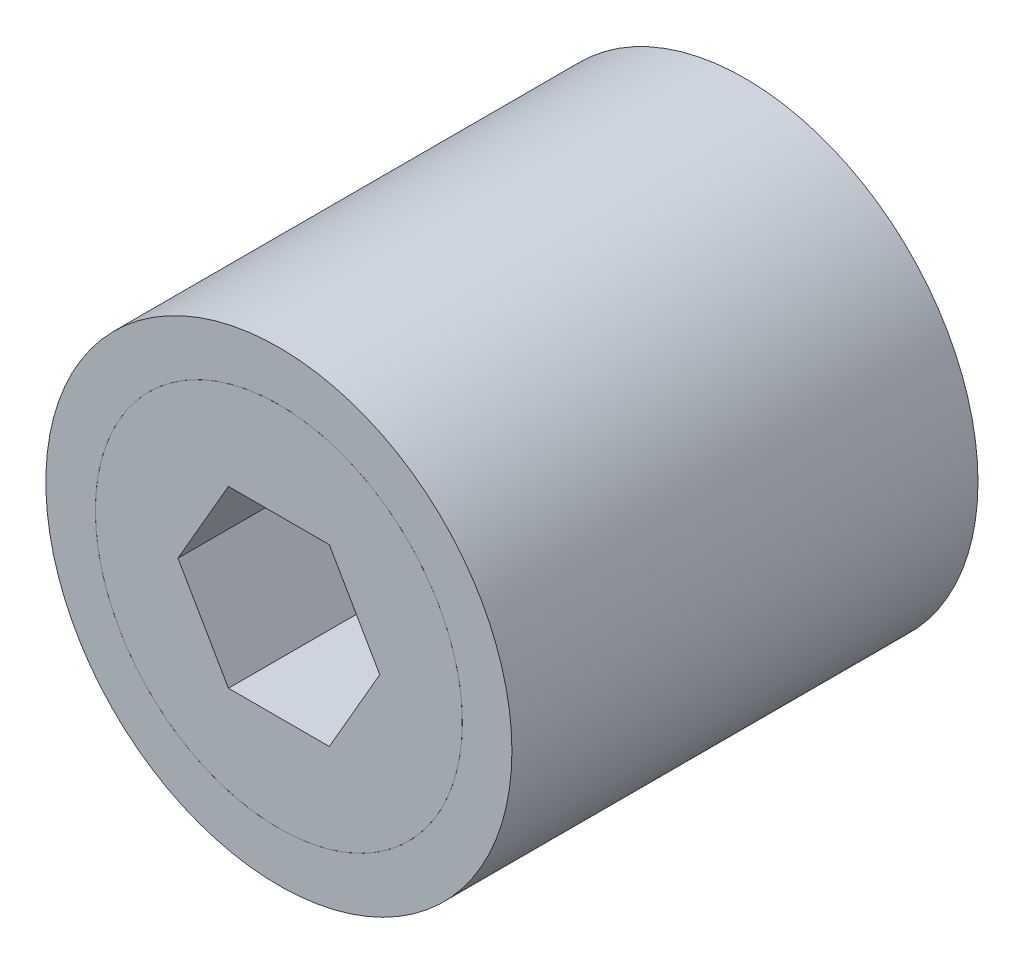
ISO-10303-21;
HEADER;
FILE_DESCRIPTION(('STEP AP214'),'2;1');
FILE_NAME('part.step','',(''),(''),'','','');
FILE_SCHEMA(('AUTOMOTIVE_DESIGN { 1 0 10303 214 1 1 1 1 }'));
ENDSEC;
DATA;
#1=APPLICATION_CONTEXT('core data for automotive mechanical design processes');
#2=APPLICATION_PROTOCOL_DEFINITION('international standard','automotive_design',2000,#1);
#3=PRODUCT_CONTEXT('',#1,'mechanical');
#4=PRODUCT('Part','Part','',(#3));
#5=PRODUCT_RELATED_PRODUCT_CATEGORY('part','',(#4));
#6=PRODUCT_DEFINITION_FORMATION('','',#4);
#7=PRODUCT_DEFINITION_CONTEXT('part definition',#1,'design');
#8=PRODUCT_DEFINITION('design','',#6,#7);
#9=PRODUCT_DEFINITION_SHAPE('','',#8);
#10=(LENGTH_UNIT() NAMED_UNIT(*) SI_UNIT(.MILLI.,.METRE.));
#11=(NAMED_UNIT(*) PLANE_ANGLE_UNIT() SI_UNIT($,.RADIAN.));
#12=(NAMED_UNIT(*) SI_UNIT($,.STERADIAN.) SOLID_ANGLE_UNIT());
#13=UNCERTAINTY_MEASURE_WITH_UNIT(LENGTH_MEASURE(1.E-05),#10,'distance_accuracy_value','');
#14=(GEOMETRIC_REPRESENTATION_CONTEXT(3) GLOBAL_UNCERTAINTY_ASSIGNED_CONTEXT((#13)) GLOBAL_UNIT_ASSIGNED_CONTEXT((#10,
#11,#12)) REPRESENTATION_CONTEXT('',''));
#15=CARTESIAN_POINT('',(0.,0.,0.));
#16=DIRECTION('',(0.,0.,1.));
#17=DIRECTION('',(1.,0.,0.));
#18=AXIS2_PLACEMENT_3D('',#15,#16,#17);
#19=CARTESIAN_POINT('',(-23.3252483873999,13.6361395501214,57.26277572465));
#20=DIRECTION('',(0.,1.,0.));
#21=DIRECTION('',(-1.,0.,0.));
#22=AXIS2_PLACEMENT_3D('',#19,#20,#21);
#23=PLANE('',#22);
#24=DIRECTION('',(1.,0.,0.));
#25=VECTOR('',#24,1.);
#26=CARTESIAN_POINT('',(-20.5756177303843,13.6361395501214,57.26277572465));
#27=LINE('',#26,#25);
#28=CARTESIAN_POINT('',(-17.8259870733687,13.6361395501214,57.26277572465));
#29=VERTEX_POINT('',#28);
#30=CARTESIAN_POINT('',(-23.3252483873999,13.6361395501214,57.26277572465));
#31=VERTEX_POINT('',#30);
#32=EDGE_CURVE('P0_E91',#29,#31,#27,.F.);
#33=ORIENTED_EDGE('',*,*,#32,.F.);
#34=DIRECTION('',(0.,0.,1.));
#35=VECTOR('',#34,1.);
#36=CARTESIAN_POINT('',(-17.8259870733687,13.6361395501214,57.26277572465));
#37=LINE('',#36,#35);
#38=CARTESIAN_POINT('',(-17.8259870733687,13.6361395501214,31.86277572465));
#39=VERTEX_POINT('',#38);
#40=EDGE_CURVE('P0_E83',#39,#29,#37,.T.);
#41=ORIENTED_EDGE('',*,*,#40,.F.);
#42=DIRECTION('',(1.,0.,0.));
#43=VECTOR('',#42,1.);
#44=CARTESIAN_POINT('',(-20.5756177303843,13.6361395501214,31.86277572465));
#45=LINE('',#44,#43);
#46=CARTESIAN_POINT('',(-23.3252483873999,13.6361395501214,31.86277572465));
#47=VERTEX_POINT('',#46);
#48=EDGE_CURVE('P0_E123',#39,#47,#45,.F.);
#49=ORIENTED_EDGE('',*,*,#48,.T.);
#50=DIRECTION('',(0.,0.,1.));
#51=VECTOR('',#50,1.);
#52=CARTESIAN_POINT('',(-23.3252483873999,13.6361395501214,57.26277572465));
#53=LINE('',#52,#51);
#54=EDGE_CURVE('P0_E108',#31,#47,#53,.F.);
#55=ORIENTED_EDGE('',*,*,#54,.F.);
#56=EDGE_LOOP('',(#33,#41,#49,#55));
#57=FACE_BOUND('',#56,.T.);
#58=ADVANCED_FACE('P0_F24',(#57),#23,.T.);
#59=CARTESIAN_POINT('',(-26.0748790444155,18.3986395501214,57.26277572465));
#60=DIRECTION('',(0.866025403784438,0.5,0.));
#61=DIRECTION('',(-0.5,0.866025403784438,0.));
#62=AXIS2_PLACEMENT_3D('',#59,#60,#61);
#63=PLANE('',#62);
#64=DIRECTION('',(-0.500000000000001,0.866025403784438,0.));
#65=VECTOR('',#64,1.);
#66=CARTESIAN_POINT('',(-23.3252483873999,13.6361395501214,57.26277572465));
#67=LINE('',#66,#65);
#68=CARTESIAN_POINT('',(-26.0748790444155,18.3986395501214,57.26277572465));
#69=VERTEX_POINT('',#68);
#70=EDGE_CURVE('P0_E116',#31,#69,#67,.T.);
#71=ORIENTED_EDGE('',*,*,#70,.F.);
#72=ORIENTED_EDGE('',*,*,#54,.T.);
#73=DIRECTION('',(-0.500000000000001,0.866025403784438,0.));
#74=VECTOR('',#73,1.);
#75=CARTESIAN_POINT('',(-23.3252483873999,13.6361395501214,31.86277572465));
#76=LINE('',#75,#74);
#77=CARTESIAN_POINT('',(-26.0748790444155,18.3986395501214,31.86277572465));
#78=VERTEX_POINT('',#77);
#79=EDGE_CURVE('P0_E114',#47,#78,#76,.T.);
#80=ORIENTED_EDGE('',*,*,#79,.T.);
#81=DIRECTION('',(0.,0.,1.));
#82=VECTOR('',#81,1.);
#83=CARTESIAN_POINT('',(-26.0748790444155,18.3986395501214,57.26277572465));
#84=LINE('',#83,#82);
#85=EDGE_CURVE('P0_E105',#69,#78,#84,.F.);
#86=ORIENTED_EDGE('',*,*,#85,.F.);
#87=EDGE_LOOP('',(#71,#72,#80,#86));
#88=FACE_BOUND('',#87,.T.);
#89=ADVANCED_FACE('P0_F113',(#88),#63,.T.);
#90=CARTESIAN_POINT('',(-23.3252483873999,23.1611395501214,57.26277572465));
#91=DIRECTION('',(0.866025403784439,-0.5,0.));
#92=DIRECTION('',(0.5,0.866025403784439,0.));
#93=AXIS2_PLACEMENT_3D('',#90,#91,#92);
#94=PLANE('',#93);
#95=DIRECTION('',(0.5,0.866025403784438,0.));
#96=VECTOR('',#95,1.);
#97=CARTESIAN_POINT('',(-26.0748790444155,18.3986395501214,57.26277572465));
#98=LINE('',#97,#96);
#99=CARTESIAN_POINT('',(-23.3252483873999,23.1611395501214,57.26277572465));
#100=VERTEX_POINT('',#99);
#101=EDGE_CURVE('P0_E133',#69,#100,#98,.T.);
#102=ORIENTED_EDGE('',*,*,#101,.F.);
#103=ORIENTED_EDGE('',*,*,#85,.T.);
#104=DIRECTION('',(0.5,0.866025403784438,0.));
#105=VECTOR('',#104,1.);
#106=CARTESIAN_POINT('',(-26.0748790444155,18.3986395501214,31.86277572465));
#107=LINE('',#106,#105);
#108=CARTESIAN_POINT('',(-23.3252483873999,23.1611395501214,31.8627757246499));
#109=VERTEX_POINT('',#108);
#110=EDGE_CURVE('P0_E125',#78,#109,#107,.T.);
#111=ORIENTED_EDGE('',*,*,#110,.T.);
#112=DIRECTION('',(0.,0.,-1.));
#113=VECTOR('',#112,1.);
#114=CARTESIAN_POINT('',(-23.3252483873999,23.1611395501214,57.26277572465));
#115=LINE('',#114,#113);
#116=EDGE_CURVE('P0_E102',#100,#109,#115,.T.);
#117=ORIENTED_EDGE('',*,*,#116,.F.);
#118=EDGE_LOOP('',(#102,#103,#111,#117));
#119=FACE_BOUND('',#118,.T.);
#120=ADVANCED_FACE('P0_F142',(#119),#94,.T.);
#121=CARTESIAN_POINT('',(-17.8259870733687,23.1611395501214,57.26277572465));
#122=DIRECTION('',(0.,-1.,0.));
#123=DIRECTION('',(0.,0.,-1.));
#124=AXIS2_PLACEMENT_3D('',#121,#122,#123);
#125=PLANE('',#124);
#126=DIRECTION('',(1.,0.,0.));
#127=VECTOR('',#126,1.);
#128=CARTESIAN_POINT('',(-20.5756177303843,23.1611395501214,57.26277572465));
#129=LINE('',#128,#127);
#130=CARTESIAN_POINT('',(-17.8259870733687,23.1611395501214,57.26277572465));
#131=VERTEX_POINT('',#130);
#132=EDGE_CURVE('P0_E96',#100,#131,#129,.T.);
#133=ORIENTED_EDGE('',*,*,#132,.F.);
#134=ORIENTED_EDGE('',*,*,#116,.T.);
#135=DIRECTION('',(1.,0.,0.));
#136=VECTOR('',#135,1.);
#137=CARTESIAN_POINT('',(-20.5756177303843,23.1611395501214,31.86277572465));
#138=LINE('',#137,#136);
#139=CARTESIAN_POINT('',(-17.8259870733687,23.1611395501214,31.86277572465));
#140=VERTEX_POINT('',#139);
#141=EDGE_CURVE('P0_E127',#109,#140,#138,.T.);
#142=ORIENTED_EDGE('',*,*,#141,.T.);
#143=DIRECTION('',(0.,0.,1.));
#144=VECTOR('',#143,1.);
#145=CARTESIAN_POINT('',(-17.8259870733687,23.1611395501214,57.26277572465));
#146=LINE('',#145,#144);
#147=EDGE_CURVE('P0_E72',#131,#140,#146,.F.);
#148=ORIENTED_EDGE('',*,*,#147,.F.);
#149=EDGE_LOOP('',(#133,#134,#142,#148));
#150=FACE_BOUND('',#149,.T.);
#151=ADVANCED_FACE('P0_F139',(#150),#125,.T.);
#152=CARTESIAN_POINT('',(-15.0763564163531,18.3986395501214,57.26277572465));
#153=DIRECTION('',(-0.866025403784439,-0.5,0.));
#154=DIRECTION('',(0.5,-0.866025403784439,0.));
#155=AXIS2_PLACEMENT_3D('',#152,#153,#154);
#156=PLANE('',#155);
#157=DIRECTION('',(0.5,-0.866025403784439,0.));
#158=VECTOR('',#157,1.);
#159=CARTESIAN_POINT('',(-17.8259870733687,23.1611395501214,57.26277572465));
#160=LINE('',#159,#158);
#161=CARTESIAN_POINT('',(-15.0763564163531,18.3986395501214,57.26277572465));
#162=VERTEX_POINT('',#161);
#163=EDGE_CURVE('P0_E78',#131,#162,#160,.T.);
#164=ORIENTED_EDGE('',*,*,#163,.F.);
#165=ORIENTED_EDGE('',*,*,#147,.T.);
#166=DIRECTION('',(0.5,-0.866025403784439,0.));
#167=VECTOR('',#166,1.);
#168=CARTESIAN_POINT('',(-17.8259870733687,23.1611395501214,31.86277572465));
#169=LINE('',#168,#167);
#170=CARTESIAN_POINT('',(-15.0763564163531,18.3986395501214,31.86277572465));
#171=VERTEX_POINT('',#170);
#172=EDGE_CURVE('P0_E40',#140,#171,#169,.T.);
#173=ORIENTED_EDGE('',*,*,#172,.T.);
#174=DIRECTION('',(0.,0.,1.));
#175=VECTOR('',#174,1.);
#176=CARTESIAN_POINT('',(-15.0763564163531,18.3986395501214,57.26277572465));
#177=LINE('',#176,#175);
#178=EDGE_CURVE('P0_E74',#162,#171,#177,.F.);
#179=ORIENTED_EDGE('',*,*,#178,.F.);
#180=EDGE_LOOP('',(#164,#165,#173,#179));
#181=FACE_BOUND('',#180,.T.);
#182=ADVANCED_FACE('P0_F76',(#181),#156,.T.);
#183=CARTESIAN_POINT('',(-17.8259870733687,13.6361395501214,57.26277572465));
#184=DIRECTION('',(-0.866025403784439,0.5,0.));
#185=DIRECTION('',(-0.5,-0.866025403784439,0.));
#186=AXIS2_PLACEMENT_3D('',#183,#184,#185);
#187=PLANE('',#186);
#188=DIRECTION('',(-0.5,-0.866025403784438,0.));
#189=VECTOR('',#188,1.);
#190=CARTESIAN_POINT('',(-15.0763564163531,18.3986395501214,57.26277572465));
#191=LINE('',#190,#189);
#192=EDGE_CURVE('P0_E86',#162,#29,#191,.T.);
#193=ORIENTED_EDGE('',*,*,#192,.F.);
#194=ORIENTED_EDGE('',*,*,#178,.T.);
#195=DIRECTION('',(-0.5,-0.866025403784438,0.));
#196=VECTOR('',#195,1.);
#197=CARTESIAN_POINT('',(-15.0763564163531,18.3986395501214,31.86277572465));
#198=LINE('',#197,#196);
#199=EDGE_CURVE('P0_E135',#171,#39,#198,.T.);
#200=ORIENTED_EDGE('',*,*,#199,.T.);
#201=ORIENTED_EDGE('',*,*,#40,.T.);
#202=EDGE_LOOP('',(#193,#194,#200,#201));
#203=FACE_BOUND('',#202,.T.);
#204=ADVANCED_FACE('P0_F87',(#203),#187,.T.);
#205=CARTESIAN_POINT('',(-20.5756177303843,18.3986395501214,57.26277572465));
#206=DIRECTION('',(0.,0.,1.));
#207=DIRECTION('',(1.,0.,0.));
#208=AXIS2_PLACEMENT_3D('',#205,#206,#207);
#209=PLANE('',#208);
#210=ORIENTED_EDGE('',*,*,#101,.T.);
#211=ORIENTED_EDGE('',*,*,#132,.T.);
#212=ORIENTED_EDGE('',*,*,#163,.T.);
#213=ORIENTED_EDGE('',*,*,#192,.T.);
#214=ORIENTED_EDGE('',*,*,#32,.T.);
#215=ORIENTED_EDGE('',*,*,#70,.T.);
#216=EDGE_LOOP('',(#210,#211,#212,#213,#214,#215));
#217=FACE_BOUND('',#216,.T.);
#218=CARTESIAN_POINT('',(-20.5756177303843,18.3986395501214,57.26277572465));
#219=DIRECTION('',(0.,0.,-1.));
#220=DIRECTION('',(-1.,0.,0.));
#221=AXIS2_PLACEMENT_3D('',#218,#219,#220);
#222=CIRCLE('',#221,10.);
#223=CARTESIAN_POINT('',(-30.5756177303843,18.3986395501214,57.26277572465));
#224=VERTEX_POINT('',#223);
#225=EDGE_CURVE('P0_E27',#224,#224,#222,.T.);
#226=ORIENTED_EDGE('',*,*,#225,.F.);
#227=EDGE_LOOP('',(#226));
#228=FACE_BOUND('',#227,.T.);
#229=ADVANCED_FACE('P0_F94',(#217,#228),#209,.T.);
#230=CARTESIAN_POINT('',(-20.5756177303843,18.3986395501214,31.86277572465));
#231=DIRECTION('',(0.,0.,1.));
#232=DIRECTION('',(1.,0.,0.));
#233=AXIS2_PLACEMENT_3D('',#230,#231,#232);
#234=PLANE('',#233);
#235=ORIENTED_EDGE('',*,*,#172,.F.);
#236=ORIENTED_EDGE('',*,*,#141,.F.);
#237=ORIENTED_EDGE('',*,*,#110,.F.);
#238=ORIENTED_EDGE('',*,*,#79,.F.);
#239=ORIENTED_EDGE('',*,*,#48,.F.);
#240=ORIENTED_EDGE('',*,*,#199,.F.);
#241=EDGE_LOOP('',(#235,#236,#237,#238,#239,#240));
#242=FACE_BOUND('',#241,.T.);
#243=CARTESIAN_POINT('',(-20.5756177303843,18.3986395501214,31.86277572465));
#244=DIRECTION('',(0.,0.,-1.));
#245=DIRECTION('',(-1.,0.,0.));
#246=AXIS2_PLACEMENT_3D('',#243,#244,#245);
#247=CIRCLE('',#246,10.);
#248=CARTESIAN_POINT('',(-30.5756177303843,18.3986395501214,31.86277572465));
#249=VERTEX_POINT('',#248);
#250=EDGE_CURVE('P0_E13',#249,#249,#247,.F.);
#251=ORIENTED_EDGE('',*,*,#250,.F.);
#252=EDGE_LOOP('',(#251));
#253=FACE_BOUND('',#252,.T.);
#254=ADVANCED_FACE('P0_F121',(#242,#253),#234,.F.);
#255=CARTESIAN_POINT('',(-20.5756177303843,18.3986395501214,57.26277572465));
#256=DIRECTION('',(0.,0.,-1.));
#257=DIRECTION('',(-1.,0.,0.));
#258=AXIS2_PLACEMENT_3D('',#255,#256,#257);
#259=CYLINDRICAL_SURFACE('',#258,10.);
#260=ORIENTED_EDGE('',*,*,#250,.T.);
#261=EDGE_LOOP('',(#260));
#262=FACE_BOUND('',#261,.T.);
#263=ORIENTED_EDGE('',*,*,#225,.T.);
#264=EDGE_LOOP('',(#263));
#265=FACE_BOUND('',#264,.T.);
#266=ADVANCED_FACE('P0_F151',(#262,#265),#259,.T.);
#267=CLOSED_SHELL('',(#58,#89,#120,#151,#182,#204,#229,#254,#266));
#268=MANIFOLD_SOLID_BREP('P0_B1',#267);
#269=CARTESIAN_POINT('',(-20.5756177303843,18.3986395501214,31.86277572465));
#270=DIRECTION('',(0.,0.,1.));
#271=DIRECTION('',(1.,0.,0.));
#272=AXIS2_PLACEMENT_3D('',#269,#270,#271);
#273=CYLINDRICAL_SURFACE('',#272,10.);
#274=CARTESIAN_POINT('',(-20.5756177303843,18.3986395501214,57.26277572465));
#275=DIRECTION('',(0.,0.,1.));
#276=DIRECTION('',(1.,0.,0.));
#277=AXIS2_PLACEMENT_3D('',#274,#275,#276);
#278=CIRCLE('',#277,10.);
#279=CARTESIAN_POINT('',(-10.5756177303843,18.3986395501214,57.26277572465));
#280=VERTEX_POINT('',#279);
#281=EDGE_CURVE('P1_E34',#280,#280,#278,.T.);
#282=ORIENTED_EDGE('',*,*,#281,.T.);
#283=EDGE_LOOP('',(#282));
#284=FACE_BOUND('',#283,.T.);
#285=CARTESIAN_POINT('',(-20.5756177303843,18.3986395501214,31.86277572465));
#286=DIRECTION('',(0.,0.,1.));
#287=DIRECTION('',(1.,0.,0.));
#288=AXIS2_PLACEMENT_3D('',#285,#286,#287);
#289=CIRCLE('',#288,10.);
#290=CARTESIAN_POINT('',(-10.5756177303843,18.3986395501214,31.86277572465));
#291=VERTEX_POINT('',#290);
#292=EDGE_CURVE('P1_E25',#291,#291,#289,.T.);
#293=ORIENTED_EDGE('',*,*,#292,.F.);
#294=EDGE_LOOP('',(#293));
#295=FACE_BOUND('',#294,.T.);
#296=ADVANCED_FACE('P1_F22',(#284,#295),#273,.F.);
#297=CARTESIAN_POINT('',(-20.5756177303843,18.3986395501214,31.86277572465));
#298=DIRECTION('',(0.,0.,-1.));
#299=DIRECTION('',(-1.,0.,0.));
#300=AXIS2_PLACEMENT_3D('',#297,#298,#299);
#301=PLANE('',#300);
#302=ORIENTED_EDGE('',*,*,#292,.T.);
#303=EDGE_LOOP('',(#302));
#304=FACE_BOUND('',#303,.T.);
#305=CARTESIAN_POINT('',(-20.5756177303843,18.3986395501214,31.86277572465));
#306=DIRECTION('',(0.,0.,1.));
#307=DIRECTION('',(1.,0.,0.));
#308=AXIS2_PLACEMENT_3D('',#305,#306,#307);
#309=CIRCLE('',#308,12.7);
#310=CARTESIAN_POINT('',(-7.87561773038433,18.3986395501214,31.86277572465));
#311=VERTEX_POINT('',#310);
#312=EDGE_CURVE('P1_E29',#311,#311,#309,.T.);
#313=ORIENTED_EDGE('',*,*,#312,.F.);
#314=EDGE_LOOP('',(#313));
#315=FACE_BOUND('',#314,.T.);
#316=ADVANCED_FACE('P1_F42',(#304,#315),#301,.T.);
#317=CARTESIAN_POINT('',(-20.5756177303843,18.3986395501214,57.26277572465));
#318=DIRECTION('',(0.,0.,-1.));
#319=DIRECTION('',(-1.,0.,0.));
#320=AXIS2_PLACEMENT_3D('',#317,#318,#319);
#321=PLANE('',#320);
#322=ORIENTED_EDGE('',*,*,#281,.F.);
#323=EDGE_LOOP('',(#322));
#324=FACE_BOUND('',#323,.T.);
#325=CARTESIAN_POINT('',(-20.5756177303843,18.3986395501214,57.26277572465));
#326=DIRECTION('',(0.,0.,1.));
#327=DIRECTION('',(1.,0.,0.));
#328=AXIS2_PLACEMENT_3D('',#325,#326,#327);
#329=CIRCLE('',#328,12.7);
#330=CARTESIAN_POINT('',(-7.87561773038433,18.3986395501214,57.26277572465));
#331=VERTEX_POINT('',#330);
#332=EDGE_CURVE('P1_E12',#331,#331,#329,.F.);
#333=ORIENTED_EDGE('',*,*,#332,.F.);
#334=EDGE_LOOP('',(#333));
#335=FACE_BOUND('',#334,.T.);
#336=ADVANCED_FACE('P1_F50',(#324,#335),#321,.F.);
#337=CARTESIAN_POINT('',(-20.5756177303843,18.3986395501214,31.86277572465));
#338=DIRECTION('',(0.,0.,1.));
#339=DIRECTION('',(1.,0.,0.));
#340=AXIS2_PLACEMENT_3D('',#337,#338,#339);
#341=CYLINDRICAL_SURFACE('',#340,12.7);
#342=ORIENTED_EDGE('',*,*,#312,.T.);
#343=EDGE_LOOP('',(#342));
#344=FACE_BOUND('',#343,.T.);
#345=ORIENTED_EDGE('',*,*,#332,.T.);
#346=EDGE_LOOP('',(#345));
#347=FACE_BOUND('',#346,.T.);
#348=ADVANCED_FACE('P1_F51',(#344,#347),#341,.T.);
#349=CLOSED_SHELL('',(#296,#316,#336,#348));
#350=MANIFOLD_SOLID_BREP('P1_B1',#349);
#351=ADVANCED_BREP_SHAPE_REPRESENTATION('',(#18,#268,#350),#14);
#352=SHAPE_DEFINITION_REPRESENTATION(#9,#351);
ENDSEC;
END-ISO-10303-21;
